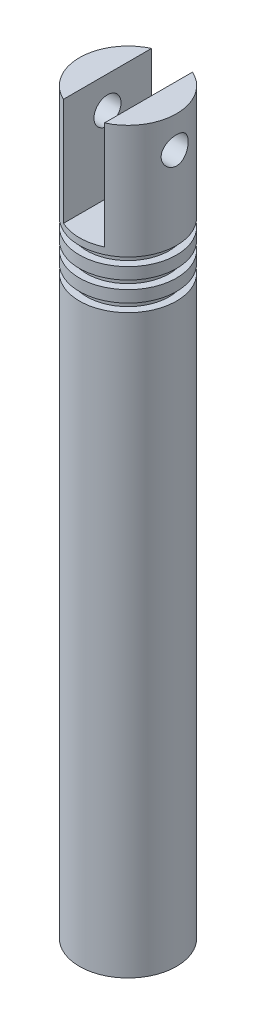
ISO-10303-21;
HEADER;
FILE_DESCRIPTION(('STEP AP214'),'2;1');
FILE_NAME('part.step','',(''),(''),'','','');
FILE_SCHEMA(('AUTOMOTIVE_DESIGN { 1 0 10303 214 1 1 1 1 }'));
ENDSEC;
DATA;
#1=APPLICATION_CONTEXT('core data for automotive mechanical design processes');
#2=APPLICATION_PROTOCOL_DEFINITION('international standard','automotive_design',2000,#1);
#3=PRODUCT_CONTEXT('',#1,'mechanical');
#4=PRODUCT('Part','Part','',(#3));
#5=PRODUCT_RELATED_PRODUCT_CATEGORY('part','',(#4));
#6=PRODUCT_DEFINITION_FORMATION('','',#4);
#7=PRODUCT_DEFINITION_CONTEXT('part definition',#1,'design');
#8=PRODUCT_DEFINITION('design','',#6,#7);
#9=PRODUCT_DEFINITION_SHAPE('','',#8);
#10=(LENGTH_UNIT() NAMED_UNIT(*) SI_UNIT(.MILLI.,.METRE.));
#11=(NAMED_UNIT(*) PLANE_ANGLE_UNIT() SI_UNIT($,.RADIAN.));
#12=(NAMED_UNIT(*) SI_UNIT($,.STERADIAN.) SOLID_ANGLE_UNIT());
#13=UNCERTAINTY_MEASURE_WITH_UNIT(LENGTH_MEASURE(1.E-05),#10,'distance_accuracy_value','');
#14=(GEOMETRIC_REPRESENTATION_CONTEXT(3) GLOBAL_UNCERTAINTY_ASSIGNED_CONTEXT((#13)) GLOBAL_UNIT_ASSIGNED_CONTEXT((#10,
#11,#12)) REPRESENTATION_CONTEXT('',''));
#15=CARTESIAN_POINT('',(0.,0.,0.));
#16=DIRECTION('',(0.,0.,1.));
#17=DIRECTION('',(1.,0.,0.));
#18=AXIS2_PLACEMENT_3D('',#15,#16,#17);
#19=CARTESIAN_POINT('',(0.,84.66582,0.));
#20=DIRECTION('',(0.,-1.,0.));
#21=DIRECTION('',(0.,0.,-1.));
#22=AXIS2_PLACEMENT_3D('',#19,#20,#21);
#23=CYLINDRICAL_SURFACE('',#22,5.56895);
#24=CARTESIAN_POINT('',(0.,67.0117641151549,0.));
#25=DIRECTION('',(0.,-1.,0.));
#26=DIRECTION('',(0.,0.,-1.));
#27=AXIS2_PLACEMENT_3D('',#24,#25,#26);
#28=CIRCLE('',#27,5.56895);
#29=CARTESIAN_POINT('',(0.,67.0117641151549,-5.56895));
#30=VERTEX_POINT('',#29);
#31=EDGE_CURVE('E186',#30,#30,#28,.T.);
#32=ORIENTED_EDGE('',*,*,#31,.F.);
#33=EDGE_LOOP('',(#32));
#34=FACE_BOUND('',#33,.T.);
#35=CARTESIAN_POINT('',(0.,68.3501539004133,0.));
#36=DIRECTION('',(0.,-1.,0.));
#37=DIRECTION('',(0.,0.,-1.));
#38=AXIS2_PLACEMENT_3D('',#35,#36,#37);
#39=CIRCLE('',#38,5.56895);
#40=CARTESIAN_POINT('',(0.,68.3501539004133,-5.56895));
#41=VERTEX_POINT('',#40);
#42=EDGE_CURVE('E190',#41,#41,#39,.T.);
#43=ORIENTED_EDGE('',*,*,#42,.T.);
#44=EDGE_LOOP('',(#43));
#45=FACE_BOUND('',#44,.T.);
#46=ADVANCED_FACE('F45',(#34,#45),#23,.T.);
#47=CARTESIAN_POINT('',(0.,69.2977641151549,0.));
#48=DIRECTION('',(0.,-1.,0.));
#49=DIRECTION('',(0.,0.,-1.));
#50=AXIS2_PLACEMENT_3D('',#47,#48,#49);
#51=CIRCLE('',#50,5.56895);
#52=CARTESIAN_POINT('',(0.,69.2977641151549,-5.56895));
#53=VERTEX_POINT('',#52);
#54=EDGE_CURVE('E202',#53,#53,#51,.T.);
#55=ORIENTED_EDGE('',*,*,#54,.F.);
#56=EDGE_LOOP('',(#55));
#57=FACE_BOUND('',#56,.T.);
#58=CARTESIAN_POINT('',(0.,70.6361539004133,0.));
#59=DIRECTION('',(0.,-1.,0.));
#60=DIRECTION('',(0.,0.,-1.));
#61=AXIS2_PLACEMENT_3D('',#58,#59,#60);
#62=CIRCLE('',#61,5.56895);
#63=CARTESIAN_POINT('',(0.,70.6361539004133,-5.56895));
#64=VERTEX_POINT('',#63);
#65=EDGE_CURVE('E206',#64,#64,#62,.T.);
#66=ORIENTED_EDGE('',*,*,#65,.T.);
#67=EDGE_LOOP('',(#66));
#68=FACE_BOUND('',#67,.T.);
#69=ADVANCED_FACE('F149',(#57,#68),#23,.T.);
#70=CARTESIAN_POINT('',(0.,71.5837641151549,0.));
#71=DIRECTION('',(0.,-1.,0.));
#72=DIRECTION('',(0.,0.,-1.));
#73=AXIS2_PLACEMENT_3D('',#70,#71,#72);
#74=CIRCLE('',#73,5.56895);
#75=CARTESIAN_POINT('',(0.,71.5837641151549,-5.56895));
#76=VERTEX_POINT('',#75);
#77=EDGE_CURVE('E218',#76,#76,#74,.T.);
#78=ORIENTED_EDGE('',*,*,#77,.F.);
#79=EDGE_LOOP('',(#78));
#80=FACE_BOUND('',#79,.T.);
#81=CARTESIAN_POINT('',(0.,84.66582,0.));
#82=DIRECTION('',(0.,1.,0.));
#83=DIRECTION('',(0.,0.,1.));
#84=AXIS2_PLACEMENT_3D('',#81,#82,#83);
#85=CIRCLE('',#84,5.56895);
#86=CARTESIAN_POINT('',(2.3495,84.66582,5.04906465124977));
#87=VERTEX_POINT('',#86);
#88=CARTESIAN_POINT('',(2.3495,84.66582,-5.04906465124977));
#89=VERTEX_POINT('',#88);
#90=EDGE_CURVE('E98',#87,#89,#85,.T.);
#91=ORIENTED_EDGE('',*,*,#90,.F.);
#92=DIRECTION('',(0.,-1.,0.));
#93=VECTOR('',#92,1.);
#94=CARTESIAN_POINT('',(2.3495,84.66582,5.04906465124977));
#95=LINE('',#94,#93);
#96=CARTESIAN_POINT('',(2.3495,72.34682,5.04906465124977));
#97=VERTEX_POINT('',#96);
#98=EDGE_CURVE('E117',#87,#97,#95,.T.);
#99=ORIENTED_EDGE('',*,*,#98,.T.);
#100=CARTESIAN_POINT('',(0.,72.34682,0.));
#101=DIRECTION('',(0.,-1.,0.));
#102=DIRECTION('',(0.,0.,-1.));
#103=AXIS2_PLACEMENT_3D('',#100,#101,#102);
#104=CIRCLE('',#103,5.56895);
#105=CARTESIAN_POINT('',(-2.3495,72.34682,5.04906465124977));
#106=VERTEX_POINT('',#105);
#107=EDGE_CURVE('E11',#97,#106,#104,.T.);
#108=ORIENTED_EDGE('',*,*,#107,.T.);
#109=DIRECTION('',(0.,-1.,0.));
#110=VECTOR('',#109,1.);
#111=CARTESIAN_POINT('',(-2.3495,84.66582,5.04906465124977));
#112=LINE('',#111,#110);
#113=CARTESIAN_POINT('',(-2.3495,84.66582,5.04906465124977));
#114=VERTEX_POINT('',#113);
#115=EDGE_CURVE('E91',#106,#114,#112,.F.);
#116=ORIENTED_EDGE('',*,*,#115,.T.);
#117=CARTESIAN_POINT('',(-2.3495,84.66582,-5.04906465124977));
#118=VERTEX_POINT('',#117);
#119=EDGE_CURVE('E104',#118,#114,#85,.T.);
#120=ORIENTED_EDGE('',*,*,#119,.F.);
#121=DIRECTION('',(0.,-1.,0.));
#122=VECTOR('',#121,1.);
#123=CARTESIAN_POINT('',(-2.3495,84.66582,-5.04906465124977));
#124=LINE('',#123,#122);
#125=CARTESIAN_POINT('',(-2.3495,72.34682,-5.04906465124977));
#126=VERTEX_POINT('',#125);
#127=EDGE_CURVE('E63',#118,#126,#124,.T.);
#128=ORIENTED_EDGE('',*,*,#127,.T.);
#129=CARTESIAN_POINT('',(2.3495,72.34682,-5.04906465124977));
#130=VERTEX_POINT('',#129);
#131=EDGE_CURVE('E56',#126,#130,#104,.T.);
#132=ORIENTED_EDGE('',*,*,#131,.T.);
#133=DIRECTION('',(0.,-1.,0.));
#134=VECTOR('',#133,1.);
#135=CARTESIAN_POINT('',(2.3495,84.66582,-5.04906465124977));
#136=LINE('',#135,#134);
#137=EDGE_CURVE('E71',#130,#89,#136,.F.);
#138=ORIENTED_EDGE('',*,*,#137,.T.);
#139=EDGE_LOOP('',(#91,#99,#108,#116,#120,#128,#132,#138));
#140=FACE_BOUND('',#139,.T.);
#141=CARTESIAN_POINT('',(5.3490712971973,81.03362,-1.5494));
#142=CARTESIAN_POINT('',(5.34907261777594,80.9484169765022,-1.54939824611398));
#143=CARTESIAN_POINT('',(5.3511293057808,80.8631959207241,-1.54234796681927));
#144=CARTESIAN_POINT('',(5.35910653019536,80.695225149187,-1.51439290243351));
#145=CARTESIAN_POINT('',(5.36502878379246,80.612476548851,-1.49348196000195));
#146=CARTESIAN_POINT('',(5.38001563051129,80.4519052920052,-1.43855435726251));
#147=CARTESIAN_POINT('',(5.38907553622012,80.374075491131,-1.40455723830766));
#148=CARTESIAN_POINT('',(5.40931077015716,80.2252095188831,-1.32448464265313));
#149=CARTESIAN_POINT('',(5.42048631522132,80.1541740449974,-1.27840792770587));
#150=CARTESIAN_POINT('',(5.4440346157587,80.0189796222275,-1.17414231335856));
#151=CARTESIAN_POINT('',(5.45643007075151,79.9550330021741,-1.11568316860774));
#152=CARTESIAN_POINT('',(5.48082630226927,79.8377132080056,-0.98889266521307));
#153=CARTESIAN_POINT('',(5.49282703463253,79.7843412136492,-0.92056020652125));
#154=CARTESIAN_POINT('',(5.51533649437575,79.6887881138428,-0.774477691286805));
#155=CARTESIAN_POINT('',(5.52581533207967,79.6468199068325,-0.696583370433262));
#156=CARTESIAN_POINT('',(5.54383877759669,79.5766572455331,-0.534503266579985));
#157=CARTESIAN_POINT('',(5.55138392578876,79.548460254372,-0.4503186456483));
#158=CARTESIAN_POINT('',(5.56252931871199,79.5073327870278,-0.280265705219842));
#159=CARTESIAN_POINT('',(5.56622284503069,79.4940406996359,-0.194491063721036));
#160=CARTESIAN_POINT('',(5.56957576867454,79.4819607469619,-0.0218550640743257));
#161=CARTESIAN_POINT('',(5.56923589863323,79.483170247585,0.0650060938534433));
#162=CARTESIAN_POINT('',(5.56462786916074,79.4998084634911,0.234825882379466));
#163=CARTESIAN_POINT('',(5.56046772802327,79.5148462009504,0.317826202443652));
#164=CARTESIAN_POINT('',(5.54881531920474,79.5580800458961,0.480075162304213));
#165=CARTESIAN_POINT('',(5.54132285356617,79.58627693511,0.559323578908403));
#166=CARTESIAN_POINT('',(5.52369109470569,79.6553164603991,0.712794149506316));
#167=CARTESIAN_POINT('',(5.5135247182974,79.6962893372389,0.786954474492033));
#168=CARTESIAN_POINT('',(5.49163494449017,79.7896168543109,0.927477562860948));
#169=CARTESIAN_POINT('',(5.47991122094527,79.8419738801245,0.993838687402164));
#170=CARTESIAN_POINT('',(5.45571086114186,79.9586434310755,1.1192138031226));
#171=CARTESIAN_POINT('',(5.44322215423476,80.0232963226719,1.17790912149822));
#172=CARTESIAN_POINT('',(5.4192483694713,80.1616549359193,1.28370631028805));
#173=CARTESIAN_POINT('',(5.40776336458734,80.2353613148527,1.33080733821128));
#174=CARTESIAN_POINT('',(5.38704560859099,80.3904745268535,1.41235066916375));
#175=CARTESIAN_POINT('',(5.37782973345554,80.4719331589362,1.44669903258452));
#176=CARTESIAN_POINT('',(5.36289956450759,80.6397908211745,1.50110533311173));
#177=CARTESIAN_POINT('',(5.35718431300458,80.7261884930437,1.52116717892699));
#178=CARTESIAN_POINT('',(5.35010863075525,80.8984735414341,1.54586629397222));
#179=CARTESIAN_POINT('',(5.3486131844923,80.9842868581477,1.55098197210458));
#180=CARTESIAN_POINT('',(5.34977568882888,81.1555442692838,1.54696766735507));
#181=CARTESIAN_POINT('',(5.35243315232939,81.2409884058291,1.53783935516556));
#182=CARTESIAN_POINT('',(5.36147090995282,81.4071888285334,1.50601947515111));
#183=CARTESIAN_POINT('',(5.36777034652594,81.4880062971559,1.48362223942372));
#184=CARTESIAN_POINT('',(5.38330166146427,81.6447356242062,1.42623464645189));
#185=CARTESIAN_POINT('',(5.39253394721215,81.7206467993694,1.39124253964737));
#186=CARTESIAN_POINT('',(5.41316268155042,81.8673916394506,1.30870883862612));
#187=CARTESIAN_POINT('',(5.42460514840619,81.938062764233,1.26089002317956));
#188=CARTESIAN_POINT('',(5.44825993712339,82.0705530882683,1.15439903622095));
#189=CARTESIAN_POINT('',(5.46047241663044,82.1323704663522,1.09572463744487));
#190=CARTESIAN_POINT('',(5.48476126342752,82.2474198199024,0.966962875443108));
#191=CARTESIAN_POINT('',(5.49682095312811,82.3003162745841,0.896571918280236));
#192=CARTESIAN_POINT('',(5.51904941708873,82.3935460891033,0.74763500263458));
#193=CARTESIAN_POINT('',(5.52921829147662,82.4338801142588,0.669089476319323));
#194=CARTESIAN_POINT('',(5.5464540029028,82.5004597777987,0.506623133440009));
#195=CARTESIAN_POINT('',(5.55354420435664,82.5268118786416,0.422748546170475));
#196=CARTESIAN_POINT('',(5.56392678483878,82.5649787031937,0.251532715609087));
#197=CARTESIAN_POINT('',(5.56722008613537,82.5767969572255,0.16419231949736));
#198=CARTESIAN_POINT('',(5.56958999733607,82.5853233344769,-0.00835318047257865));
#199=CARTESIAN_POINT('',(5.56880340058175,82.5825216253498,-0.09353251156366));
#200=CARTESIAN_POINT('',(5.56341562109041,82.5630369703003,-0.262158455048127));
#201=CARTESIAN_POINT('',(5.55881460479421,82.5463546300541,-0.345605142881928));
#202=CARTESIAN_POINT('',(5.546346253333,82.4998688914655,-0.50775237207953));
#203=CARTESIAN_POINT('',(5.53850563162633,82.4701726854524,-0.586485835949387));
#204=CARTESIAN_POINT('',(5.5203743517246,82.3985975238492,-0.73789701172176));
#205=CARTESIAN_POINT('',(5.51008332772838,82.3567167491141,-0.810573817284844));
#206=CARTESIAN_POINT('',(5.48777982732698,82.2605703992874,-0.950058643477917));
#207=CARTESIAN_POINT('',(5.47572661084381,82.2059855440309,-1.01664004040642));
#208=CARTESIAN_POINT('',(5.45140977297305,82.0865756860567,-1.13986334796933));
#209=CARTESIAN_POINT('',(5.43914609543869,82.021747911655,-1.19650255951449));
#210=CARTESIAN_POINT('',(5.4154478245943,81.8817809059332,-1.29961626931176));
#211=CARTESIAN_POINT('',(5.40404094176701,81.8064277740264,-1.34580740282208));
#212=CARTESIAN_POINT('',(5.38375470599452,81.6487171077851,-1.42480290708564));
#213=CARTESIAN_POINT('',(5.3748738419657,81.5663637994715,-1.45761528622601));
#214=CARTESIAN_POINT('',(5.3617621335257,81.4093059065344,-1.50506592248224));
#215=CARTESIAN_POINT('',(5.35704364616332,81.3352245986099,-1.52165000727293));
#216=CARTESIAN_POINT('',(5.35069785500624,81.1853067937841,-1.54381706220283));
#217=CARTESIAN_POINT('',(5.34907012157463,81.1094705423163,-1.5494015613672));
#218=CARTESIAN_POINT('',(5.3490712971973,81.03362,-1.5494));
#219=B_SPLINE_CURVE_WITH_KNOTS('',3,(#141,#142,#143,#144,#145,#146,#147,#148,#149,#150,#151,
#152,#153,#154,#155,#156,#157,#158,#159,#160,#161,#162,#163,#164,#165,#166,#167,#168,#169,#170,
#171,#172,#173,#174,#175,#176,#177,#178,#179,#180,#181,#182,#183,#184,#185,#186,#187,#188,#189,
#190,#191,#192,#193,#194,#195,#196,#197,#198,#199,#200,#201,#202,#203,#204,#205,#206,#207,#208,
#209,#210,#211,#212,#213,#214,#215,#216,#217,#218),.UNSPECIFIED.,.T.,.F.,(4,2,2,2,2,2,2,2,2,2,2,
2,2,2,2,2,2,2,2,2,2,2,2,2,2,2,2,2,2,2,2,2,2,2,2,2,2,2,4),(0.,0.255329871239733,
0.510773244087368,0.765836638536446,1.02092618909233,1.28229533205164,1.54369361827735,
1.80968063755478,2.07561863938988,2.33495478338208,2.59424382179976,2.84641993150395,
3.09861102378906,3.3534620314406,3.6083664954175,3.87176850625135,4.13518965136126,
4.40051444114835,4.66576661168517,4.92243000625594,5.17906329877424,5.43020651430742,
5.68138462974712,5.93850305516951,6.19567429276693,6.4610234272927,6.72635850628779,
6.98964315001339,7.25286382833134,7.50731732031522,7.76175970989676,8.01414458890766,
8.26656716810541,8.52619214952186,8.78588750488933,9.05195205023008,9.31785709738088,
9.54519177540471,9.77249484996719),.UNSPECIFIED.);
#220=CARTESIAN_POINT('',(5.3490712971973,81.03362,-1.5494));
#221=VERTEX_POINT('',#220);
#222=EDGE_CURVE('E226',#221,#221,#219,.T.);
#223=ORIENTED_EDGE('',*,*,#222,.T.);
#224=EDGE_LOOP('',(#223));
#225=FACE_BOUND('',#224,.T.);
#226=CARTESIAN_POINT('',(-5.56895,79.48422,0.));
#227=CARTESIAN_POINT('',(-5.56894886646992,79.4842217223687,-0.0852750903052789));
#228=CARTESIAN_POINT('',(-5.56697223013018,79.4912835171188,-0.170568157626901));
#229=CARTESIAN_POINT('',(-5.55927935668216,79.5192884606617,-0.338688208799902));
#230=CARTESIAN_POINT('',(-5.5535615509484,79.5402374322223,-0.421514142976248));
#231=CARTESIAN_POINT('',(-5.53901591420422,79.5952761374307,-0.582249568663938));
#232=CARTESIAN_POINT('',(-5.53019229086671,79.629348098283,-0.660165544497845));
#233=CARTESIAN_POINT('',(-5.51036232293971,79.7095973411567,-0.809177925012699));
#234=CARTESIAN_POINT('',(-5.49935578264836,79.7557757086556,-0.880273717405245));
#235=CARTESIAN_POINT('',(-5.47603520932248,79.8601476072753,-1.01540862979831));
#236=CARTESIAN_POINT('',(-5.46369729928041,79.9185884748449,-1.07925259722161));
#237=CARTESIAN_POINT('',(-5.43925412859256,80.0452982819233,-1.19637183897069));
#238=CARTESIAN_POINT('',(-5.42714890100962,80.1135686066096,-1.24964562121435));
#239=CARTESIAN_POINT('',(-5.40429473922676,80.2595882195061,-1.34508870368251));
#240=CARTESIAN_POINT('',(-5.39357578441799,80.3374923544185,-1.38702894495473));
#241=CARTESIAN_POINT('',(-5.37506084439868,80.4995932381069,-1.45713729059044));
#242=CARTESIAN_POINT('',(-5.36726426682563,80.5837887074822,-1.48530818633682));
#243=CARTESIAN_POINT('',(-5.35572413255061,80.7539104162913,-1.52639170774742));
#244=CARTESIAN_POINT('',(-5.35188623226639,80.839744152544,-1.53966020982251));
#245=CARTESIAN_POINT('',(-5.34841651225438,81.0124985053957,-1.55167244523319));
#246=CARTESIAN_POINT('',(-5.34878383055272,81.0994188956069,-1.5504191552042));
#247=CARTESIAN_POINT('',(-5.35359887900438,81.2690636297002,-1.53370489918249));
#248=CARTESIAN_POINT('',(-5.35792150649532,81.3518350116681,-1.5186795068969));
#249=CARTESIAN_POINT('',(-5.3699591170494,81.5136328308529,-1.47554722996529));
#250=CARTESIAN_POINT('',(-5.37767439255071,81.5926589445861,-1.44743921761641));
#251=CARTESIAN_POINT('',(-5.39573453866844,81.7458347946176,-1.3785962435279));
#252=CARTESIAN_POINT('',(-5.40611013173446,81.8199138621904,-1.33771244500128));
#253=CARTESIAN_POINT('',(-5.4283059205784,81.9603107339809,-1.24458211887296));
#254=CARTESIAN_POINT('',(-5.44012642295217,82.026626885118,-1.19233317785765));
#255=CARTESIAN_POINT('',(-5.4643964634599,82.1520982532861,-1.07574989581832));
#256=CARTESIAN_POINT('',(-5.4768534051384,82.2109139761104,-1.01105116792998));
#257=CARTESIAN_POINT('',(-5.50061643106914,82.3169334762595,-0.87255505560798));
#258=CARTESIAN_POINT('',(-5.51192246164339,82.3641367121285,-0.798757247151872));
#259=CARTESIAN_POINT('',(-5.53218986353255,82.4457593325235,-0.643601734691559));
#260=CARTESIAN_POINT('',(-5.54113905224771,82.4801126649944,-0.56220758636118));
#261=CARTESIAN_POINT('',(-5.55559657982055,82.5345476839526,-0.394492329344546));
#262=CARTESIAN_POINT('',(-5.56110573945858,82.5546327749559,-0.308172401302686));
#263=CARTESIAN_POINT('',(-5.56793643079316,82.5794174257745,-0.135949411637182));
#264=CARTESIAN_POINT('',(-5.56938341182658,82.5845780440978,-0.0501175757138495));
#265=CARTESIAN_POINT('',(-5.56828984490397,82.5806468821974,0.121186815408532));
#266=CARTESIAN_POINT('',(-5.5657497485987,82.5715567162836,0.20665941020224));
#267=CARTESIAN_POINT('',(-5.55704887257568,82.5397585870324,0.373141856321003));
#268=CARTESIAN_POINT('',(-5.55095760049603,82.5173118833994,0.454205577790802));
#269=CARTESIAN_POINT('',(-5.535849361905,82.4597448891451,0.611405885521778));
#270=CARTESIAN_POINT('',(-5.52683206497992,82.4246231671805,0.687541914170996));
#271=CARTESIAN_POINT('',(-5.50658315418479,82.341875420099,0.834485540249852));
#272=CARTESIAN_POINT('',(-5.49530929847827,82.2940039883999,0.905148972602762));
#273=CARTESIAN_POINT('',(-5.47184814776021,82.1874206519491,1.03760010115604));
#274=CARTESIAN_POINT('',(-5.45966065620324,82.1287064106453,1.09938587916954));
#275=CARTESIAN_POINT('',(-5.4352773537571,81.9999463270011,1.2143007335279));
#276=CARTESIAN_POINT('',(-5.42309291779501,81.9296064482047,1.26710340357686));
#277=CARTESIAN_POINT('',(-5.40050452053712,81.7808032128305,1.36016797661416));
#278=CARTESIAN_POINT('',(-5.39010049145551,81.7023401657105,1.40043035709953));
#279=CARTESIAN_POINT('',(-5.37237218781838,81.5398736731973,1.4669723330305));
#280=CARTESIAN_POINT('',(-5.36503090707606,81.455903900656,1.49332936140855));
#281=CARTESIAN_POINT('',(-5.35426853212468,81.2844820453361,1.53147409966951));
#282=CARTESIAN_POINT('',(-5.35084632606971,81.1970309574994,1.54326594178685));
#283=CARTESIAN_POINT('',(-5.34840817666557,81.024486383897,1.5516928096517));
#284=CARTESIAN_POINT('',(-5.34923903040179,80.9394204312625,1.54885480253375));
#285=CARTESIAN_POINT('',(-5.35485144636319,80.7710312097409,1.5293367943175));
#286=CARTESIAN_POINT('',(-5.35963288926794,80.6877078882986,1.51265721127901));
#287=CARTESIAN_POINT('',(-5.3725125223332,80.5258983872096,1.46624719376804));
#288=CARTESIAN_POINT('',(-5.38057992100495,80.4473748819886,1.43663773949957));
#289=CARTESIAN_POINT('',(-5.39912090154403,80.2963490241429,1.36530205112028));
#290=CARTESIAN_POINT('',(-5.40959489040431,80.2238476927912,1.32357376720581));
#291=CARTESIAN_POINT('',(-5.43218500803502,80.0844319743779,1.22762732170521));
#292=CARTESIAN_POINT('',(-5.44434277752097,80.0177686978074,1.17305405451547));
#293=CARTESIAN_POINT('',(-5.46870879717597,79.8943750848324,1.05362996770397));
#294=CARTESIAN_POINT('',(-5.48091705912133,79.8376472169843,0.988776601487592));
#295=CARTESIAN_POINT('',(-5.50435794260465,79.7343946792228,0.848763065921507));
#296=CARTESIAN_POINT('',(-5.51556025734247,79.6881463977559,0.773393537176614));
#297=CARTESIAN_POINT('',(-5.5353857217512,79.6090481068204,0.615638285063539));
#298=CARTESIAN_POINT('',(-5.54401037985709,79.5761902572119,0.533256701534134));
#299=CARTESIAN_POINT('',(-5.55671255428821,79.5286505920904,0.376091509884556));
#300=CARTESIAN_POINT('',(-5.56126670035793,79.5120298865827,0.301927407162903));
#301=CARTESIAN_POINT('',(-5.56738575025213,79.489814478886,0.151846814400494));
#302=CARTESIAN_POINT('',(-5.56895100931636,79.4842184663707,0.0759305336979007));
#303=CARTESIAN_POINT('',(-5.56895,79.48422,0.));
#304=B_SPLINE_CURVE_WITH_KNOTS('',3,(#226,#227,#228,#229,#230,#231,#232,#233,#234,#235,#236,
#237,#238,#239,#240,#241,#242,#243,#244,#245,#246,#247,#248,#249,#250,#251,#252,#253,#254,#255,
#256,#257,#258,#259,#260,#261,#262,#263,#264,#265,#266,#267,#268,#269,#270,#271,#272,#273,#274,
#275,#276,#277,#278,#279,#280,#281,#282,#283,#284,#285,#286,#287,#288,#289,#290,#291,#292,#293,
#294,#295,#296,#297,#298,#299,#300,#301,#302,#303),.UNSPECIFIED.,.T.,.F.,(4,2,2,2,2,2,2,2,2,2,2,
2,2,2,2,2,2,2,2,2,2,2,2,2,2,2,2,2,2,2,2,2,2,2,2,2,2,2,4),(0.,0.255546664669048,
0.511200545576623,0.766509398601311,1.02184115081078,1.28292745493054,1.54405058768484,
1.81011201918465,2.07611949113536,2.3356297425657,2.5950868012679,2.84661091679575,
3.09815671735379,3.35274971730627,3.60739683352738,3.8711204962548,4.13485645330626,
4.39993004034015,4.66494035744182,4.92167144636596,5.17837345523679,5.43021209832901,
5.68207918954187,5.93919679850071,6.19636987935809,6.46148797020638,6.7265959649096,
6.99021167504277,7.25375257855992,7.50786855004517,7.76197684669559,8.01375684747758,
8.26557945967148,8.52541322635413,8.78531146015263,9.05142384737467,9.31738020032739,
9.54495077446232,9.77249429934837),.UNSPECIFIED.);
#305=CARTESIAN_POINT('',(-5.56895,79.48422,0.));
#306=VERTEX_POINT('',#305);
#307=EDGE_CURVE('E131',#306,#306,#304,.T.);
#308=ORIENTED_EDGE('',*,*,#307,.T.);
#309=EDGE_LOOP('',(#308));
#310=FACE_BOUND('',#309,.T.);
#311=ADVANCED_FACE('F102',(#80,#140,#225,#310),#23,.T.);
#312=CARTESIAN_POINT('',(0.,84.66582,0.));
#313=DIRECTION('',(0.,1.,0.));
#314=DIRECTION('',(0.,0.,1.));
#315=AXIS2_PLACEMENT_3D('',#312,#313,#314);
#316=PLANE('',#315);
#317=DIRECTION('',(0.,0.,-1.));
#318=VECTOR('',#317,1.);
#319=CARTESIAN_POINT('',(2.3495,84.66582,0.));
#320=LINE('',#319,#318);
#321=EDGE_CURVE('E97',#87,#89,#320,.T.);
#322=ORIENTED_EDGE('',*,*,#321,.F.);
#323=ORIENTED_EDGE('',*,*,#90,.T.);
#324=EDGE_LOOP('',(#322,#323));
#325=FACE_BOUND('',#324,.T.);
#326=ADVANCED_FACE('F141',(#325),#316,.T.);
#327=DIRECTION('',(0.,0.,1.));
#328=VECTOR('',#327,1.);
#329=CARTESIAN_POINT('',(-2.3495,84.66582,0.));
#330=LINE('',#329,#328);
#331=EDGE_CURVE('E88',#118,#114,#330,.T.);
#332=ORIENTED_EDGE('',*,*,#331,.F.);
#333=ORIENTED_EDGE('',*,*,#119,.T.);
#334=EDGE_LOOP('',(#332,#333));
#335=FACE_BOUND('',#334,.T.);
#336=ADVANCED_FACE('F109',(#335),#316,.T.);
#337=CARTESIAN_POINT('',(0.,72.34682,0.));
#338=DIRECTION('',(0.,-1.,0.));
#339=DIRECTION('',(0.,0.,-1.));
#340=AXIS2_PLACEMENT_3D('',#337,#338,#339);
#341=PLANE('',#340);
#342=DIRECTION('',(0.,0.,-1.));
#343=VECTOR('',#342,1.);
#344=CARTESIAN_POINT('',(2.3495,72.34682,8.06574012879879));
#345=LINE('',#344,#343);
#346=EDGE_CURVE('E127',#97,#130,#345,.T.);
#347=ORIENTED_EDGE('',*,*,#346,.T.);
#348=ORIENTED_EDGE('',*,*,#131,.F.);
#349=DIRECTION('',(0.,0.,1.));
#350=VECTOR('',#349,1.);
#351=CARTESIAN_POINT('',(-2.3495,72.34682,8.06574012879879));
#352=LINE('',#351,#350);
#353=EDGE_CURVE('E107',#126,#106,#352,.T.);
#354=ORIENTED_EDGE('',*,*,#353,.T.);
#355=ORIENTED_EDGE('',*,*,#107,.F.);
#356=EDGE_LOOP('',(#347,#348,#354,#355));
#357=FACE_BOUND('',#356,.T.);
#358=ADVANCED_FACE('F126',(#357),#341,.F.);
#359=CARTESIAN_POINT('',(2.3495,72.34682,8.06574012879879));
#360=DIRECTION('',(1.,0.,0.));
#361=DIRECTION('',(0.,0.,-1.));
#362=AXIS2_PLACEMENT_3D('',#359,#360,#361);
#363=PLANE('',#362);
#364=CARTESIAN_POINT('',(2.3495,81.03362,0.));
#365=DIRECTION('',(1.,0.,0.));
#366=DIRECTION('',(0.,0.,-1.));
#367=AXIS2_PLACEMENT_3D('',#364,#365,#366);
#368=CIRCLE('',#367,1.5494);
#369=CARTESIAN_POINT('',(2.3495,81.03362,-1.5494));
#370=VERTEX_POINT('',#369);
#371=EDGE_CURVE('E222',#370,#370,#368,.T.);
#372=ORIENTED_EDGE('',*,*,#371,.T.);
#373=EDGE_LOOP('',(#372));
#374=FACE_BOUND('',#373,.T.);
#375=ORIENTED_EDGE('',*,*,#321,.T.);
#376=ORIENTED_EDGE('',*,*,#137,.F.);
#377=ORIENTED_EDGE('',*,*,#346,.F.);
#378=ORIENTED_EDGE('',*,*,#98,.F.);
#379=EDGE_LOOP('',(#375,#376,#377,#378));
#380=FACE_BOUND('',#379,.T.);
#381=ADVANCED_FACE('F139',(#374,#380),#363,.F.);
#382=CARTESIAN_POINT('',(-2.3495,72.34682,8.06574012879879));
#383=DIRECTION('',(-1.,0.,0.));
#384=DIRECTION('',(0.,0.,1.));
#385=AXIS2_PLACEMENT_3D('',#382,#383,#384);
#386=PLANE('',#385);
#387=CARTESIAN_POINT('',(-2.3495,81.03362,0.));
#388=DIRECTION('',(-1.,0.,0.));
#389=DIRECTION('',(0.,0.,1.));
#390=AXIS2_PLACEMENT_3D('',#387,#388,#389);
#391=CIRCLE('',#390,1.5494);
#392=CARTESIAN_POINT('',(-2.3495,81.03362,1.5494));
#393=VERTEX_POINT('',#392);
#394=EDGE_CURVE('E50',#393,#393,#391,.T.);
#395=ORIENTED_EDGE('',*,*,#394,.T.);
#396=EDGE_LOOP('',(#395));
#397=FACE_BOUND('',#396,.T.);
#398=ORIENTED_EDGE('',*,*,#331,.T.);
#399=ORIENTED_EDGE('',*,*,#115,.F.);
#400=ORIENTED_EDGE('',*,*,#353,.F.);
#401=ORIENTED_EDGE('',*,*,#127,.F.);
#402=EDGE_LOOP('',(#398,#399,#400,#401));
#403=FACE_BOUND('',#402,.T.);
#404=ADVANCED_FACE('F90',(#397,#403),#386,.F.);
#405=CARTESIAN_POINT('',(-5.56895,81.03362,0.));
#406=DIRECTION('',(1.,0.,0.));
#407=DIRECTION('',(0.,0.,-1.));
#408=AXIS2_PLACEMENT_3D('',#405,#406,#407);
#409=CYLINDRICAL_SURFACE('',#408,1.5494);
#410=ORIENTED_EDGE('',*,*,#394,.F.);
#411=EDGE_LOOP('',(#410));
#412=FACE_BOUND('',#411,.T.);
#413=ORIENTED_EDGE('',*,*,#307,.F.);
#414=EDGE_LOOP('',(#413));
#415=FACE_BOUND('',#414,.T.);
#416=ADVANCED_FACE('F236',(#412,#415),#409,.F.);
#417=ORIENTED_EDGE('',*,*,#371,.F.);
#418=EDGE_LOOP('',(#417));
#419=FACE_BOUND('',#418,.T.);
#420=ORIENTED_EDGE('',*,*,#222,.F.);
#421=EDGE_LOOP('',(#420));
#422=FACE_BOUND('',#421,.T.);
#423=ADVANCED_FACE('F241',(#419,#422),#409,.F.);
#424=CARTESIAN_POINT('',(0.,71.5837641151549,-5.56895));
#425=DIRECTION('',(0.,1.,0.));
#426=DIRECTION('',(0.,0.,1.));
#427=AXIS2_PLACEMENT_3D('',#424,#425,#426);
#428=PLANE('',#427);
#429=CARTESIAN_POINT('',(0.,71.5837641151549,0.));
#430=DIRECTION('',(0.,-1.,0.));
#431=DIRECTION('',(0.,0.,-1.));
#432=AXIS2_PLACEMENT_3D('',#429,#430,#431);
#433=CIRCLE('',#432,4.7250644039022);
#434=CARTESIAN_POINT('',(0.,71.5837641151549,-4.7250644039022));
#435=VERTEX_POINT('',#434);
#436=EDGE_CURVE('E214',#435,#435,#433,.T.);
#437=ORIENTED_EDGE('',*,*,#436,.F.);
#438=EDGE_LOOP('',(#437));
#439=FACE_BOUND('',#438,.T.);
#440=ORIENTED_EDGE('',*,*,#77,.T.);
#441=EDGE_LOOP('',(#440));
#442=FACE_BOUND('',#441,.T.);
#443=ADVANCED_FACE('F243',(#439,#442),#428,.F.);
#444=CARTESIAN_POINT('',(0.,-4.233291,0.));
#445=DIRECTION('',(0.,-1.,0.));
#446=DIRECTION('',(0.,0.,-1.));
#447=AXIS2_PLACEMENT_3D('',#444,#445,#446);
#448=CYLINDRICAL_SURFACE('',#447,4.7250644039022);
#449=CARTESIAN_POINT('',(0.,70.6361539004133,0.));
#450=DIRECTION('',(0.,-1.,0.));
#451=DIRECTION('',(0.,0.,-1.));
#452=AXIS2_PLACEMENT_3D('',#449,#450,#451);
#453=CIRCLE('',#452,4.7250644039022);
#454=CARTESIAN_POINT('',(0.,70.6361539004133,-4.7250644039022));
#455=VERTEX_POINT('',#454);
#456=EDGE_CURVE('E210',#455,#455,#453,.T.);
#457=ORIENTED_EDGE('',*,*,#456,.F.);
#458=EDGE_LOOP('',(#457));
#459=FACE_BOUND('',#458,.T.);
#460=ORIENTED_EDGE('',*,*,#436,.T.);
#461=EDGE_LOOP('',(#460));
#462=FACE_BOUND('',#461,.T.);
#463=ADVANCED_FACE('F270',(#459,#462),#448,.T.);
#464=CARTESIAN_POINT('',(0.,70.6361539004133,-4.7250644039022));
#465=DIRECTION('',(0.,-1.,0.));
#466=DIRECTION('',(0.,0.,-1.));
#467=AXIS2_PLACEMENT_3D('',#464,#465,#466);
#468=PLANE('',#467);
#469=ORIENTED_EDGE('',*,*,#65,.F.);
#470=EDGE_LOOP('',(#469));
#471=FACE_BOUND('',#470,.T.);
#472=ORIENTED_EDGE('',*,*,#456,.T.);
#473=EDGE_LOOP('',(#472));
#474=FACE_BOUND('',#473,.T.);
#475=ADVANCED_FACE('F275',(#471,#474),#468,.F.);
#476=CARTESIAN_POINT('',(0.,69.2977641151549,-5.56895));
#477=DIRECTION('',(0.,1.,0.));
#478=DIRECTION('',(0.,0.,1.));
#479=AXIS2_PLACEMENT_3D('',#476,#477,#478);
#480=PLANE('',#479);
#481=CARTESIAN_POINT('',(0.,69.2977641151549,0.));
#482=DIRECTION('',(0.,-1.,0.));
#483=DIRECTION('',(0.,0.,-1.));
#484=AXIS2_PLACEMENT_3D('',#481,#482,#483);
#485=CIRCLE('',#484,4.7250644039022);
#486=CARTESIAN_POINT('',(0.,69.2977641151549,-4.7250644039022));
#487=VERTEX_POINT('',#486);
#488=EDGE_CURVE('E198',#487,#487,#485,.T.);
#489=ORIENTED_EDGE('',*,*,#488,.F.);
#490=EDGE_LOOP('',(#489));
#491=FACE_BOUND('',#490,.T.);
#492=ORIENTED_EDGE('',*,*,#54,.T.);
#493=EDGE_LOOP('',(#492));
#494=FACE_BOUND('',#493,.T.);
#495=ADVANCED_FACE('F283',(#491,#494),#480,.F.);
#496=CARTESIAN_POINT('',(0.,-6.519291,0.));
#497=DIRECTION('',(0.,-1.,0.));
#498=DIRECTION('',(0.,0.,-1.));
#499=AXIS2_PLACEMENT_3D('',#496,#497,#498);
#500=CYLINDRICAL_SURFACE('',#499,4.7250644039022);
#501=CARTESIAN_POINT('',(0.,68.3501539004133,0.));
#502=DIRECTION('',(0.,-1.,0.));
#503=DIRECTION('',(0.,0.,-1.));
#504=AXIS2_PLACEMENT_3D('',#501,#502,#503);
#505=CIRCLE('',#504,4.7250644039022);
#506=CARTESIAN_POINT('',(0.,68.3501539004133,-4.7250644039022));
#507=VERTEX_POINT('',#506);
#508=EDGE_CURVE('E194',#507,#507,#505,.T.);
#509=ORIENTED_EDGE('',*,*,#508,.F.);
#510=EDGE_LOOP('',(#509));
#511=FACE_BOUND('',#510,.T.);
#512=ORIENTED_EDGE('',*,*,#488,.T.);
#513=EDGE_LOOP('',(#512));
#514=FACE_BOUND('',#513,.T.);
#515=ADVANCED_FACE('F290',(#511,#514),#500,.T.);
#516=CARTESIAN_POINT('',(0.,68.3501539004133,-4.7250644039022));
#517=DIRECTION('',(0.,-1.,0.));
#518=DIRECTION('',(0.,0.,-1.));
#519=AXIS2_PLACEMENT_3D('',#516,#517,#518);
#520=PLANE('',#519);
#521=ORIENTED_EDGE('',*,*,#42,.F.);
#522=EDGE_LOOP('',(#521));
#523=FACE_BOUND('',#522,.T.);
#524=ORIENTED_EDGE('',*,*,#508,.T.);
#525=EDGE_LOOP('',(#524));
#526=FACE_BOUND('',#525,.T.);
#527=ADVANCED_FACE('F294',(#523,#526),#520,.F.);
#528=CARTESIAN_POINT('',(0.,67.0117641151549,-5.56895));
#529=DIRECTION('',(0.,1.,0.));
#530=DIRECTION('',(0.,0.,1.));
#531=AXIS2_PLACEMENT_3D('',#528,#529,#530);
#532=PLANE('',#531);
#533=CARTESIAN_POINT('',(0.,67.0117641151549,0.));
#534=DIRECTION('',(0.,-1.,0.));
#535=DIRECTION('',(0.,0.,-1.));
#536=AXIS2_PLACEMENT_3D('',#533,#534,#535);
#537=CIRCLE('',#536,4.7250644039022);
#538=CARTESIAN_POINT('',(0.,67.0117641151549,-4.7250644039022));
#539=VERTEX_POINT('',#538);
#540=EDGE_CURVE('E180',#539,#539,#537,.T.);
#541=ORIENTED_EDGE('',*,*,#540,.F.);
#542=EDGE_LOOP('',(#541));
#543=FACE_BOUND('',#542,.T.);
#544=ORIENTED_EDGE('',*,*,#31,.T.);
#545=EDGE_LOOP('',(#544));
#546=FACE_BOUND('',#545,.T.);
#547=ADVANCED_FACE('F298',(#543,#546),#532,.F.);
#548=CARTESIAN_POINT('',(0.,-8.805291,0.));
#549=DIRECTION('',(0.,-1.,0.));
#550=DIRECTION('',(0.,0.,-1.));
#551=AXIS2_PLACEMENT_3D('',#548,#549,#550);
#552=CYLINDRICAL_SURFACE('',#551,4.7250644039022);
#553=CARTESIAN_POINT('',(0.,66.0641539004133,0.));
#554=DIRECTION('',(0.,-1.,0.));
#555=DIRECTION('',(0.,0.,-1.));
#556=AXIS2_PLACEMENT_3D('',#553,#554,#555);
#557=CIRCLE('',#556,4.7250644039022);
#558=CARTESIAN_POINT('',(0.,66.0641539004133,-4.7250644039022));
#559=VERTEX_POINT('',#558);
#560=EDGE_CURVE('E176',#559,#559,#557,.T.);
#561=ORIENTED_EDGE('',*,*,#560,.F.);
#562=EDGE_LOOP('',(#561));
#563=FACE_BOUND('',#562,.T.);
#564=ORIENTED_EDGE('',*,*,#540,.T.);
#565=EDGE_LOOP('',(#564));
#566=FACE_BOUND('',#565,.T.);
#567=ADVANCED_FACE('F302',(#563,#566),#552,.T.);
#568=CARTESIAN_POINT('',(0.,66.0641539004133,-4.7250644039022));
#569=DIRECTION('',(0.,-1.,0.));
#570=DIRECTION('',(0.,0.,-1.));
#571=AXIS2_PLACEMENT_3D('',#568,#569,#570);
#572=PLANE('',#571);
#573=CARTESIAN_POINT('',(0.,66.0641539004133,0.));
#574=DIRECTION('',(0.,-1.,0.));
#575=DIRECTION('',(0.,0.,-1.));
#576=AXIS2_PLACEMENT_3D('',#573,#574,#575);
#577=CIRCLE('',#576,5.56895);
#578=CARTESIAN_POINT('',(0.,66.0641539004133,-5.56895));
#579=VERTEX_POINT('',#578);
#580=EDGE_CURVE('E172',#579,#579,#577,.T.);
#581=ORIENTED_EDGE('',*,*,#580,.F.);
#582=EDGE_LOOP('',(#581));
#583=FACE_BOUND('',#582,.T.);
#584=ORIENTED_EDGE('',*,*,#560,.T.);
#585=EDGE_LOOP('',(#584));
#586=FACE_BOUND('',#585,.T.);
#587=ADVANCED_FACE('F167',(#583,#586),#572,.F.);
#588=CARTESIAN_POINT('',(0.,0.,0.));
#589=DIRECTION('',(0.,1.,0.));
#590=DIRECTION('',(0.,0.,1.));
#591=AXIS2_PLACEMENT_3D('',#588,#589,#590);
#592=PLANE('',#591);
#593=CARTESIAN_POINT('',(0.,0.,0.));
#594=DIRECTION('',(0.,1.,0.));
#595=DIRECTION('',(0.,0.,1.));
#596=AXIS2_PLACEMENT_3D('',#593,#594,#595);
#597=CIRCLE('',#596,5.56895);
#598=CARTESIAN_POINT('',(0.,0.,5.56895));
#599=VERTEX_POINT('',#598);
#600=EDGE_CURVE('E111',#599,#599,#597,.T.);
#601=ORIENTED_EDGE('',*,*,#600,.F.);
#602=EDGE_LOOP('',(#601));
#603=FACE_BOUND('',#602,.T.);
#604=ADVANCED_FACE('F162',(#603),#592,.F.);
#605=ORIENTED_EDGE('',*,*,#580,.T.);
#606=EDGE_LOOP('',(#605));
#607=FACE_BOUND('',#606,.T.);
#608=ORIENTED_EDGE('',*,*,#600,.T.);
#609=EDGE_LOOP('',(#608));
#610=FACE_BOUND('',#609,.T.);
#611=ADVANCED_FACE('F47',(#607,#610),#23,.T.);
#612=CLOSED_SHELL('',(#46,#69,#311,#326,#336,#358,#381,#404,#416,#423,#443,#463,#475,#495,#515,
#527,#547,#567,#587,#604,#611));
#613=MANIFOLD_SOLID_BREP('B2',#612);
#614=ADVANCED_BREP_SHAPE_REPRESENTATION('',(#18,#613),#14);
#615=SHAPE_DEFINITION_REPRESENTATION(#9,#614);
ENDSEC;
END-ISO-10303-21;
